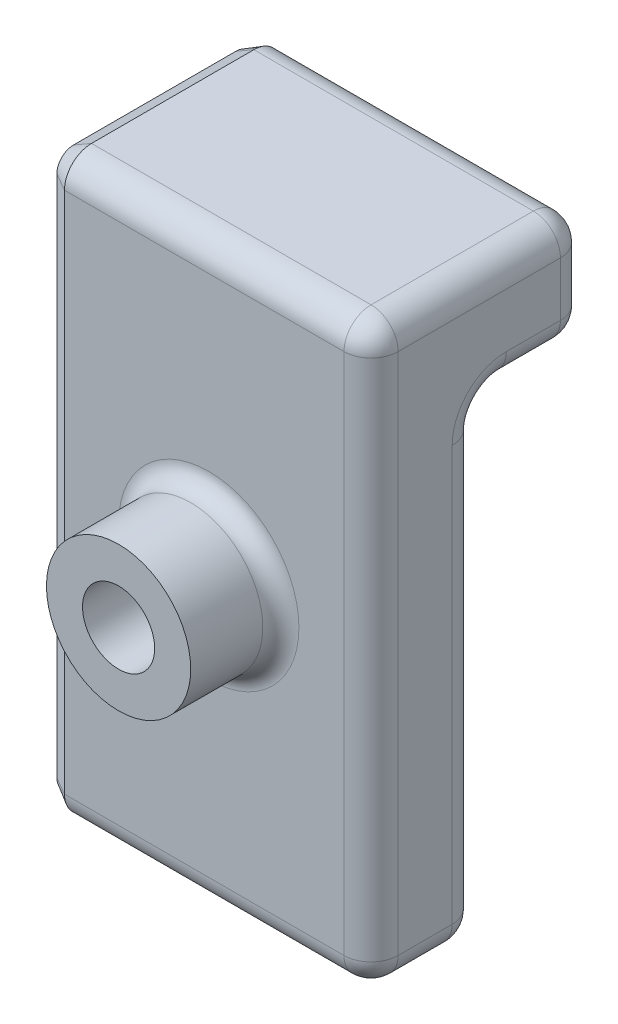
ISO-10303-21;
HEADER;
FILE_DESCRIPTION(('STEP AP214'),'2;1');
FILE_NAME('part.step','',(''),(''),'','','');
FILE_SCHEMA(('AUTOMOTIVE_DESIGN { 1 0 10303 214 1 1 1 1 }'));
ENDSEC;
DATA;
#1=APPLICATION_CONTEXT('core data for automotive mechanical design processes');
#2=APPLICATION_PROTOCOL_DEFINITION('international standard','automotive_design',2000,#1);
#3=PRODUCT_CONTEXT('',#1,'mechanical');
#4=PRODUCT('Part','Part','',(#3));
#5=PRODUCT_RELATED_PRODUCT_CATEGORY('part','',(#4));
#6=PRODUCT_DEFINITION_FORMATION('','',#4);
#7=PRODUCT_DEFINITION_CONTEXT('part definition',#1,'design');
#8=PRODUCT_DEFINITION('design','',#6,#7);
#9=PRODUCT_DEFINITION_SHAPE('','',#8);
#10=(LENGTH_UNIT() NAMED_UNIT(*) SI_UNIT(.MILLI.,.METRE.));
#11=(NAMED_UNIT(*) PLANE_ANGLE_UNIT() SI_UNIT($,.RADIAN.));
#12=(NAMED_UNIT(*) SI_UNIT($,.STERADIAN.) SOLID_ANGLE_UNIT());
#13=UNCERTAINTY_MEASURE_WITH_UNIT(LENGTH_MEASURE(1.E-05),#10,'distance_accuracy_value','');
#14=(GEOMETRIC_REPRESENTATION_CONTEXT(3) GLOBAL_UNCERTAINTY_ASSIGNED_CONTEXT((#13)) GLOBAL_UNIT_ASSIGNED_CONTEXT((#10,
#11,#12)) REPRESENTATION_CONTEXT('',''));
#15=CARTESIAN_POINT('',(0.,0.,0.));
#16=DIRECTION('',(0.,0.,1.));
#17=DIRECTION('',(1.,0.,0.));
#18=AXIS2_PLACEMENT_3D('',#15,#16,#17);
#19=CARTESIAN_POINT('',(18.,0.,0.));
#20=DIRECTION('',(0.,0.,-1.));
#21=DIRECTION('',(-1.,0.,0.));
#22=AXIS2_PLACEMENT_3D('',#19,#20,#21);
#23=PLANE('',#22);
#24=CARTESIAN_POINT('',(9.,16.,0.));
#25=DIRECTION('',(0.,0.,-1.));
#26=DIRECTION('',(-1.,0.,0.));
#27=AXIS2_PLACEMENT_3D('',#24,#25,#26);
#28=CIRCLE('',#27,5.);
#29=CARTESIAN_POINT('',(4.,16.,0.));
#30=VERTEX_POINT('',#29);
#31=EDGE_CURVE('E11',#30,#30,#28,.T.);
#32=ORIENTED_EDGE('',*,*,#31,.T.);
#33=EDGE_LOOP('',(#32));
#34=FACE_BOUND('',#33,.T.);
#35=DIRECTION('',(-1.,0.,0.));
#36=VECTOR('',#35,1.);
#37=CARTESIAN_POINT('',(18.,30.5,0.));
#38=LINE('',#37,#36);
#39=CARTESIAN_POINT('',(16.5,30.5,0.));
#40=VERTEX_POINT('',#39);
#41=CARTESIAN_POINT('',(1.00000000000001,30.5,0.));
#42=VERTEX_POINT('',#41);
#43=EDGE_CURVE('E699',#40,#42,#38,.T.);
#44=ORIENTED_EDGE('',*,*,#43,.T.);
#45=DIRECTION('',(0.,-1.,0.));
#46=VECTOR('',#45,1.);
#47=CARTESIAN_POINT('',(1.00000000000001,1.5,0.));
#48=LINE('',#47,#46);
#49=CARTESIAN_POINT('',(1.00000000000001,1.5,0.));
#50=VERTEX_POINT('',#49);
#51=EDGE_CURVE('E59',#42,#50,#48,.T.);
#52=ORIENTED_EDGE('',*,*,#51,.T.);
#53=DIRECTION('',(-1.,0.,0.));
#54=VECTOR('',#53,1.);
#55=CARTESIAN_POINT('',(18.,1.5,0.));
#56=LINE('',#55,#54);
#57=CARTESIAN_POINT('',(16.5,1.5,0.));
#58=VERTEX_POINT('',#57);
#59=EDGE_CURVE('E680',#50,#58,#56,.F.);
#60=ORIENTED_EDGE('',*,*,#59,.T.);
#61=DIRECTION('',(0.,-1.,0.));
#62=VECTOR('',#61,1.);
#63=CARTESIAN_POINT('',(16.5,0.,0.));
#64=LINE('',#63,#62);
#65=EDGE_CURVE('E696',#58,#40,#64,.F.);
#66=ORIENTED_EDGE('',*,*,#65,.T.);
#67=EDGE_LOOP('',(#44,#52,#60,#66));
#68=FACE_BOUND('',#67,.T.);
#69=ADVANCED_FACE('F43',(#34,#68),#23,.F.);
#70=CARTESIAN_POINT('',(18.,0.,-6.));
#71=DIRECTION('',(0.,1.,0.));
#72=DIRECTION('',(0.,0.,1.));
#73=AXIS2_PLACEMENT_3D('',#70,#71,#72);
#74=PLANE('',#73);
#75=DIRECTION('',(-1.,0.,0.));
#76=VECTOR('',#75,1.);
#77=CARTESIAN_POINT('',(18.,0.,-1.5));
#78=LINE('',#77,#76);
#79=CARTESIAN_POINT('',(16.5,0.,-1.5));
#80=VERTEX_POINT('',#79);
#81=CARTESIAN_POINT('',(1.00000000000001,0.,-1.5));
#82=VERTEX_POINT('',#81);
#83=EDGE_CURVE('E615',#80,#82,#78,.T.);
#84=ORIENTED_EDGE('',*,*,#83,.T.);
#85=DIRECTION('',(0.,0.,-1.));
#86=VECTOR('',#85,1.);
#87=CARTESIAN_POINT('',(1.00000000000001,0.,-4.5));
#88=LINE('',#87,#86);
#89=CARTESIAN_POINT('',(1.00000000000001,0.,-4.5));
#90=VERTEX_POINT('',#89);
#91=EDGE_CURVE('E276',#82,#90,#88,.T.);
#92=ORIENTED_EDGE('',*,*,#91,.T.);
#93=DIRECTION('',(-1.,0.,0.));
#94=VECTOR('',#93,1.);
#95=CARTESIAN_POINT('',(18.,0.,-4.5));
#96=LINE('',#95,#94);
#97=CARTESIAN_POINT('',(16.5,0.,-4.5));
#98=VERTEX_POINT('',#97);
#99=EDGE_CURVE('E628',#90,#98,#96,.F.);
#100=ORIENTED_EDGE('',*,*,#99,.T.);
#101=DIRECTION('',(0.,0.,-1.));
#102=VECTOR('',#101,1.);
#103=CARTESIAN_POINT('',(16.5,0.,-6.));
#104=LINE('',#103,#102);
#105=EDGE_CURVE('E620',#98,#80,#104,.F.);
#106=ORIENTED_EDGE('',*,*,#105,.T.);
#107=EDGE_LOOP('',(#84,#92,#100,#106));
#108=FACE_BOUND('',#107,.T.);
#109=ADVANCED_FACE('F412',(#108),#74,.F.);
#110=CARTESIAN_POINT('',(18.,26.,-6.));
#111=DIRECTION('',(0.,0.,1.));
#112=DIRECTION('',(0.,-1.,0.));
#113=AXIS2_PLACEMENT_3D('',#110,#111,#112);
#114=PLANE('',#113);
#115=CARTESIAN_POINT('',(9.,16.,-6.));
#116=DIRECTION('',(0.,0.,1.));
#117=DIRECTION('',(0.,-1.,0.));
#118=AXIS2_PLACEMENT_3D('',#115,#116,#117);
#119=CIRCLE('',#118,2.);
#120=CARTESIAN_POINT('',(9.,14.,-6.));
#121=VERTEX_POINT('',#120);
#122=EDGE_CURVE('E218',#121,#121,#119,.T.);
#123=ORIENTED_EDGE('',*,*,#122,.T.);
#124=EDGE_LOOP('',(#123));
#125=FACE_BOUND('',#124,.T.);
#126=DIRECTION('',(-1.,0.,0.));
#127=VECTOR('',#126,1.);
#128=CARTESIAN_POINT('',(18.,1.5,-6.));
#129=LINE('',#128,#127);
#130=CARTESIAN_POINT('',(16.5,1.5,-6.));
#131=VERTEX_POINT('',#130);
#132=CARTESIAN_POINT('',(1.00000000000001,1.5,-6.));
#133=VERTEX_POINT('',#132);
#134=EDGE_CURVE('E674',#131,#133,#129,.T.);
#135=ORIENTED_EDGE('',*,*,#134,.T.);
#136=DIRECTION('',(0.,1.,0.));
#137=VECTOR('',#136,1.);
#138=CARTESIAN_POINT('',(1.00000000000001,24.5,-6.));
#139=LINE('',#138,#137);
#140=CARTESIAN_POINT('',(1.00000000000001,24.5,-6.));
#141=VERTEX_POINT('',#140);
#142=EDGE_CURVE('E333',#133,#141,#139,.T.);
#143=ORIENTED_EDGE('',*,*,#142,.T.);
#144=DIRECTION('',(-1.,0.,0.));
#145=VECTOR('',#144,1.);
#146=CARTESIAN_POINT('',(18.,24.5,-6.));
#147=LINE('',#146,#145);
#148=CARTESIAN_POINT('',(16.5,24.5,-6.));
#149=VERTEX_POINT('',#148);
#150=EDGE_CURVE('E685',#141,#149,#147,.F.);
#151=ORIENTED_EDGE('',*,*,#150,.T.);
#152=DIRECTION('',(0.,1.,0.));
#153=VECTOR('',#152,1.);
#154=CARTESIAN_POINT('',(16.5,26.,-6.));
#155=LINE('',#154,#153);
#156=EDGE_CURVE('E681',#149,#131,#155,.F.);
#157=ORIENTED_EDGE('',*,*,#156,.T.);
#158=EDGE_LOOP('',(#135,#143,#151,#157));
#159=FACE_BOUND('',#158,.T.);
#160=ADVANCED_FACE('F420',(#125,#159),#114,.F.);
#161=CARTESIAN_POINT('',(18.,26.,-12.));
#162=DIRECTION('',(0.,1.,0.));
#163=DIRECTION('',(0.,0.,1.));
#164=AXIS2_PLACEMENT_3D('',#161,#162,#163);
#165=PLANE('',#164);
#166=DIRECTION('',(-1.,0.,0.));
#167=VECTOR('',#166,1.);
#168=CARTESIAN_POINT('',(0.,26.,-7.5));
#169=LINE('',#168,#167);
#170=CARTESIAN_POINT('',(16.5,26.,-7.5));
#171=VERTEX_POINT('',#170);
#172=CARTESIAN_POINT('',(1.00000000000001,26.,-7.5));
#173=VERTEX_POINT('',#172);
#174=EDGE_CURVE('E641',#171,#173,#169,.T.);
#175=ORIENTED_EDGE('',*,*,#174,.T.);
#176=DIRECTION('',(0.,0.,-1.));
#177=VECTOR('',#176,1.);
#178=CARTESIAN_POINT('',(1.00000000000001,26.,-10.5));
#179=LINE('',#178,#177);
#180=CARTESIAN_POINT('',(1.00000000000001,26.,-10.5));
#181=VERTEX_POINT('',#180);
#182=EDGE_CURVE('E321',#173,#181,#179,.T.);
#183=ORIENTED_EDGE('',*,*,#182,.T.);
#184=DIRECTION('',(-1.,0.,0.));
#185=VECTOR('',#184,1.);
#186=CARTESIAN_POINT('',(18.,26.,-10.5));
#187=LINE('',#186,#185);
#188=CARTESIAN_POINT('',(16.5,26.,-10.5));
#189=VERTEX_POINT('',#188);
#190=EDGE_CURVE('E281',#181,#189,#187,.F.);
#191=ORIENTED_EDGE('',*,*,#190,.T.);
#192=DIRECTION('',(0.,0.,-1.));
#193=VECTOR('',#192,1.);
#194=CARTESIAN_POINT('',(16.5,26.,-12.));
#195=LINE('',#194,#193);
#196=EDGE_CURVE('E231',#189,#171,#195,.F.);
#197=ORIENTED_EDGE('',*,*,#196,.T.);
#198=EDGE_LOOP('',(#175,#183,#191,#197));
#199=FACE_BOUND('',#198,.T.);
#200=ADVANCED_FACE('F434',(#199),#165,.F.);
#201=CARTESIAN_POINT('',(18.,32.,-12.));
#202=DIRECTION('',(0.,0.,1.));
#203=DIRECTION('',(1.,0.,0.));
#204=AXIS2_PLACEMENT_3D('',#201,#202,#203);
#205=PLANE('',#204);
#206=DIRECTION('',(-1.,0.,0.));
#207=VECTOR('',#206,1.);
#208=CARTESIAN_POINT('',(18.,27.5,-12.));
#209=LINE('',#208,#207);
#210=CARTESIAN_POINT('',(16.5,27.5,-12.));
#211=VERTEX_POINT('',#210);
#212=CARTESIAN_POINT('',(1.00000000000001,27.5,-12.));
#213=VERTEX_POINT('',#212);
#214=EDGE_CURVE('E637',#211,#213,#209,.T.);
#215=ORIENTED_EDGE('',*,*,#214,.T.);
#216=DIRECTION('',(0.,1.,0.));
#217=VECTOR('',#216,1.);
#218=CARTESIAN_POINT('',(1.00000000000001,30.5,-12.));
#219=LINE('',#218,#217);
#220=CARTESIAN_POINT('',(1.00000000000001,30.5,-12.));
#221=VERTEX_POINT('',#220);
#222=EDGE_CURVE('E330',#213,#221,#219,.T.);
#223=ORIENTED_EDGE('',*,*,#222,.T.);
#224=DIRECTION('',(-1.,0.,0.));
#225=VECTOR('',#224,1.);
#226=CARTESIAN_POINT('',(18.,30.5,-12.));
#227=LINE('',#226,#225);
#228=CARTESIAN_POINT('',(16.5,30.5,-12.));
#229=VERTEX_POINT('',#228);
#230=EDGE_CURVE('E634',#221,#229,#227,.F.);
#231=ORIENTED_EDGE('',*,*,#230,.T.);
#232=DIRECTION('',(0.,1.,0.));
#233=VECTOR('',#232,1.);
#234=CARTESIAN_POINT('',(16.5,32.,-12.));
#235=LINE('',#234,#233);
#236=EDGE_CURVE('E631',#229,#211,#235,.F.);
#237=ORIENTED_EDGE('',*,*,#236,.T.);
#238=EDGE_LOOP('',(#215,#223,#231,#237));
#239=FACE_BOUND('',#238,.T.);
#240=ADVANCED_FACE('F430',(#239),#205,.F.);
#241=CARTESIAN_POINT('',(18.,32.,0.));
#242=DIRECTION('',(0.,-1.,0.));
#243=DIRECTION('',(0.,0.,-1.));
#244=AXIS2_PLACEMENT_3D('',#241,#242,#243);
#245=PLANE('',#244);
#246=DIRECTION('',(-1.,0.,0.));
#247=VECTOR('',#246,1.);
#248=CARTESIAN_POINT('',(18.,32.,-10.5));
#249=LINE('',#248,#247);
#250=CARTESIAN_POINT('',(16.5,32.,-10.5));
#251=VERTEX_POINT('',#250);
#252=CARTESIAN_POINT('',(1.00000000000001,32.,-10.5));
#253=VERTEX_POINT('',#252);
#254=EDGE_CURVE('E612',#251,#253,#249,.T.);
#255=ORIENTED_EDGE('',*,*,#254,.T.);
#256=DIRECTION('',(0.,0.,1.));
#257=VECTOR('',#256,1.);
#258=CARTESIAN_POINT('',(1.00000000000001,32.,-1.5));
#259=LINE('',#258,#257);
#260=CARTESIAN_POINT('',(1.00000000000001,32.,-1.5));
#261=VERTEX_POINT('',#260);
#262=EDGE_CURVE('E318',#253,#261,#259,.T.);
#263=ORIENTED_EDGE('',*,*,#262,.T.);
#264=DIRECTION('',(-1.,0.,0.));
#265=VECTOR('',#264,1.);
#266=CARTESIAN_POINT('',(18.,32.,-1.5));
#267=LINE('',#266,#265);
#268=CARTESIAN_POINT('',(16.5,32.,-1.5));
#269=VERTEX_POINT('',#268);
#270=EDGE_CURVE('E609',#261,#269,#267,.F.);
#271=ORIENTED_EDGE('',*,*,#270,.T.);
#272=DIRECTION('',(0.,0.,1.));
#273=VECTOR('',#272,1.);
#274=CARTESIAN_POINT('',(16.5,32.,0.));
#275=LINE('',#274,#273);
#276=EDGE_CURVE('E622',#269,#251,#275,.F.);
#277=ORIENTED_EDGE('',*,*,#276,.T.);
#278=EDGE_LOOP('',(#255,#263,#271,#277));
#279=FACE_BOUND('',#278,.T.);
#280=ADVANCED_FACE('F427',(#279),#245,.F.);
#281=CARTESIAN_POINT('',(18.,0.,0.));
#282=DIRECTION('',(-1.,0.,0.));
#283=DIRECTION('',(0.,0.,1.));
#284=AXIS2_PLACEMENT_3D('',#281,#282,#283);
#285=PLANE('',#284);
#286=DIRECTION('',(0.,-1.,0.));
#287=VECTOR('',#286,1.);
#288=CARTESIAN_POINT('',(18.,0.,-1.5));
#289=LINE('',#288,#287);
#290=CARTESIAN_POINT('',(18.,30.5,-1.5));
#291=VERTEX_POINT('',#290);
#292=CARTESIAN_POINT('',(18.,1.5,-1.5));
#293=VERTEX_POINT('',#292);
#294=EDGE_CURVE('E204',#291,#293,#289,.T.);
#295=ORIENTED_EDGE('',*,*,#294,.T.);
#296=DIRECTION('',(0.,0.,-1.));
#297=VECTOR('',#296,1.);
#298=CARTESIAN_POINT('',(18.,1.5,0.));
#299=LINE('',#298,#297);
#300=CARTESIAN_POINT('',(18.,1.5,-4.5));
#301=VERTEX_POINT('',#300);
#302=EDGE_CURVE('E669',#293,#301,#299,.T.);
#303=ORIENTED_EDGE('',*,*,#302,.T.);
#304=DIRECTION('',(0.,1.,0.));
#305=VECTOR('',#304,1.);
#306=CARTESIAN_POINT('',(18.,0.,-4.5));
#307=LINE('',#306,#305);
#308=CARTESIAN_POINT('',(18.,24.5,-4.5));
#309=VERTEX_POINT('',#308);
#310=EDGE_CURVE('E733',#301,#309,#307,.T.);
#311=ORIENTED_EDGE('',*,*,#310,.T.);
#312=CARTESIAN_POINT('',(18.,24.5,-7.5));
#313=DIRECTION('',(-1.,0.,0.));
#314=DIRECTION('',(0.,0.,1.));
#315=AXIS2_PLACEMENT_3D('',#312,#313,#314);
#316=CIRCLE('',#315,3.);
#317=CARTESIAN_POINT('',(18.,27.5,-7.5));
#318=VERTEX_POINT('',#317);
#319=EDGE_CURVE('E198',#318,#309,#316,.F.);
#320=ORIENTED_EDGE('',*,*,#319,.F.);
#321=DIRECTION('',(0.,0.,-1.));
#322=VECTOR('',#321,1.);
#323=CARTESIAN_POINT('',(18.,27.5,0.));
#324=LINE('',#323,#322);
#325=CARTESIAN_POINT('',(18.,27.5,-10.5));
#326=VERTEX_POINT('',#325);
#327=EDGE_CURVE('E191',#318,#326,#324,.T.);
#328=ORIENTED_EDGE('',*,*,#327,.T.);
#329=DIRECTION('',(0.,1.,0.));
#330=VECTOR('',#329,1.);
#331=CARTESIAN_POINT('',(18.,0.,-10.5));
#332=LINE('',#331,#330);
#333=CARTESIAN_POINT('',(18.,30.5,-10.5));
#334=VERTEX_POINT('',#333);
#335=EDGE_CURVE('E194',#326,#334,#332,.T.);
#336=ORIENTED_EDGE('',*,*,#335,.T.);
#337=DIRECTION('',(0.,0.,1.));
#338=VECTOR('',#337,1.);
#339=CARTESIAN_POINT('',(18.,30.5,0.));
#340=LINE('',#339,#338);
#341=EDGE_CURVE('E205',#334,#291,#340,.T.);
#342=ORIENTED_EDGE('',*,*,#341,.T.);
#343=EDGE_LOOP('',(#295,#303,#311,#320,#328,#336,#342));
#344=FACE_BOUND('',#343,.T.);
#345=ADVANCED_FACE('F193',(#344),#285,.F.);
#346=CARTESIAN_POINT('',(0.,0.,0.));
#347=DIRECTION('',(-1.,0.,0.));
#348=DIRECTION('',(0.,0.,1.));
#349=AXIS2_PLACEMENT_3D('',#346,#347,#348);
#350=PLANE('',#349);
#351=CARTESIAN_POINT('',(0.,27.5,-10.5));
#352=DIRECTION('',(-1.,0.,0.));
#353=DIRECTION('',(0.,0.,1.));
#354=AXIS2_PLACEMENT_3D('',#351,#352,#353);
#355=CIRCLE('',#354,0.922649730810372);
#356=CARTESIAN_POINT('',(0.,27.5,-11.4226497308104));
#357=VERTEX_POINT('',#356);
#358=CARTESIAN_POINT('',(0.,26.5773502691896,-10.5));
#359=VERTEX_POINT('',#358);
#360=EDGE_CURVE('E312',#357,#359,#355,.T.);
#361=ORIENTED_EDGE('',*,*,#360,.T.);
#362=DIRECTION('',(0.,0.,1.));
#363=VECTOR('',#362,1.);
#364=CARTESIAN_POINT('',(0.,26.5773502691896,-7.5));
#365=LINE('',#364,#363);
#366=CARTESIAN_POINT('',(0.,26.5773502691896,-7.5));
#367=VERTEX_POINT('',#366);
#368=EDGE_CURVE('E315',#359,#367,#365,.T.);
#369=ORIENTED_EDGE('',*,*,#368,.T.);
#370=CARTESIAN_POINT('',(0.,24.5,-7.5));
#371=DIRECTION('',(-1.,0.,0.));
#372=DIRECTION('',(0.,0.,1.));
#373=AXIS2_PLACEMENT_3D('',#370,#371,#372);
#374=CIRCLE('',#373,2.07735026918963);
#375=CARTESIAN_POINT('',(0.,24.5,-5.42264973081037));
#376=VERTEX_POINT('',#375);
#377=EDGE_CURVE('E309',#367,#376,#374,.F.);
#378=ORIENTED_EDGE('',*,*,#377,.T.);
#379=DIRECTION('',(0.,-1.,0.));
#380=VECTOR('',#379,1.);
#381=CARTESIAN_POINT('',(0.,1.5,-5.42264973081037));
#382=LINE('',#381,#380);
#383=CARTESIAN_POINT('',(0.,1.5,-5.42264973081037));
#384=VERTEX_POINT('',#383);
#385=EDGE_CURVE('E303',#376,#384,#382,.T.);
#386=ORIENTED_EDGE('',*,*,#385,.T.);
#387=CARTESIAN_POINT('',(0.,1.5,-4.5));
#388=DIRECTION('',(-1.,0.,0.));
#389=DIRECTION('',(0.,0.,1.));
#390=AXIS2_PLACEMENT_3D('',#387,#388,#389);
#391=CIRCLE('',#390,0.922649730810373);
#392=CARTESIAN_POINT('',(0.,0.577350269189626,-4.5));
#393=VERTEX_POINT('',#392);
#394=EDGE_CURVE('E297',#384,#393,#391,.T.);
#395=ORIENTED_EDGE('',*,*,#394,.T.);
#396=DIRECTION('',(0.,0.,1.));
#397=VECTOR('',#396,1.);
#398=CARTESIAN_POINT('',(0.,0.577350269189626,-1.5));
#399=LINE('',#398,#397);
#400=CARTESIAN_POINT('',(0.,0.577350269189626,-1.5));
#401=VERTEX_POINT('',#400);
#402=EDGE_CURVE('E293',#393,#401,#399,.T.);
#403=ORIENTED_EDGE('',*,*,#402,.T.);
#404=CARTESIAN_POINT('',(0.,1.5,-1.5));
#405=DIRECTION('',(-1.,0.,0.));
#406=DIRECTION('',(0.,0.,1.));
#407=AXIS2_PLACEMENT_3D('',#404,#405,#406);
#408=CIRCLE('',#407,0.922649730810374);
#409=CARTESIAN_POINT('',(0.,1.5,-0.577350269189626));
#410=VERTEX_POINT('',#409);
#411=EDGE_CURVE('E284',#401,#410,#408,.T.);
#412=ORIENTED_EDGE('',*,*,#411,.T.);
#413=DIRECTION('',(0.,1.,0.));
#414=VECTOR('',#413,1.);
#415=CARTESIAN_POINT('',(0.,30.5,-0.577350269189626));
#416=LINE('',#415,#414);
#417=CARTESIAN_POINT('',(0.,30.5,-0.577350269189626));
#418=VERTEX_POINT('',#417);
#419=EDGE_CURVE('E280',#410,#418,#416,.T.);
#420=ORIENTED_EDGE('',*,*,#419,.T.);
#421=CARTESIAN_POINT('',(0.,30.5,-1.5));
#422=DIRECTION('',(-1.,0.,0.));
#423=DIRECTION('',(0.,0.,1.));
#424=AXIS2_PLACEMENT_3D('',#421,#422,#423);
#425=CIRCLE('',#424,0.922649730810375);
#426=CARTESIAN_POINT('',(0.,31.4226497308104,-1.5));
#427=VERTEX_POINT('',#426);
#428=EDGE_CURVE('E287',#418,#427,#425,.T.);
#429=ORIENTED_EDGE('',*,*,#428,.T.);
#430=DIRECTION('',(0.,0.,-1.));
#431=VECTOR('',#430,1.);
#432=CARTESIAN_POINT('',(0.,31.4226497308104,-10.5));
#433=LINE('',#432,#431);
#434=CARTESIAN_POINT('',(0.,31.4226497308104,-10.5));
#435=VERTEX_POINT('',#434);
#436=EDGE_CURVE('E290',#427,#435,#433,.T.);
#437=ORIENTED_EDGE('',*,*,#436,.T.);
#438=CARTESIAN_POINT('',(0.,30.5,-10.5));
#439=DIRECTION('',(-1.,0.,0.));
#440=DIRECTION('',(0.,0.,1.));
#441=AXIS2_PLACEMENT_3D('',#438,#439,#440);
#442=CIRCLE('',#441,0.922649730810375);
#443=CARTESIAN_POINT('',(0.,30.5,-11.4226497308104));
#444=VERTEX_POINT('',#443);
#445=EDGE_CURVE('E300',#435,#444,#442,.T.);
#446=ORIENTED_EDGE('',*,*,#445,.T.);
#447=DIRECTION('',(0.,-1.,0.));
#448=VECTOR('',#447,1.);
#449=CARTESIAN_POINT('',(0.,27.5,-11.4226497308104));
#450=LINE('',#449,#448);
#451=EDGE_CURVE('E306',#444,#357,#450,.T.);
#452=ORIENTED_EDGE('',*,*,#451,.T.);
#453=EDGE_LOOP('',(#361,#369,#378,#386,#395,#403,#412,#420,#429,#437,#446,#452));
#454=FACE_BOUND('',#453,.T.);
#455=ADVANCED_FACE('F425',(#454),#350,.T.);
#456=CARTESIAN_POINT('',(9.,16.,-18.));
#457=DIRECTION('',(0.,0.,1.));
#458=DIRECTION('',(1.,0.,0.));
#459=AXIS2_PLACEMENT_3D('',#456,#457,#458);
#460=CYLINDRICAL_SURFACE('',#459,2.);
#461=ORIENTED_EDGE('',*,*,#122,.F.);
#462=EDGE_LOOP('',(#461));
#463=FACE_BOUND('',#462,.T.);
#464=CARTESIAN_POINT('',(9.,16.,5.));
#465=DIRECTION('',(0.,0.,1.));
#466=DIRECTION('',(1.,0.,0.));
#467=AXIS2_PLACEMENT_3D('',#464,#465,#466);
#468=CIRCLE('',#467,2.);
#469=CARTESIAN_POINT('',(11.,16.,5.));
#470=VERTEX_POINT('',#469);
#471=EDGE_CURVE('E748',#470,#470,#468,.T.);
#472=ORIENTED_EDGE('',*,*,#471,.T.);
#473=EDGE_LOOP('',(#472));
#474=FACE_BOUND('',#473,.T.);
#475=ADVANCED_FACE('F508',(#463,#474),#460,.F.);
#476=CARTESIAN_POINT('',(18.,30.5,-1.5));
#477=DIRECTION('',(-1.,0.,0.));
#478=DIRECTION('',(0.,0.,1.));
#479=AXIS2_PLACEMENT_3D('',#476,#477,#478);
#480=CYLINDRICAL_SURFACE('',#479,1.5);
#481=ORIENTED_EDGE('',*,*,#270,.F.);
#482=CARTESIAN_POINT('',(1.00000000000001,30.5,-1.5));
#483=DIRECTION('',(-1.,0.,0.));
#484=DIRECTION('',(0.,0.,1.));
#485=AXIS2_PLACEMENT_3D('',#482,#483,#484);
#486=CIRCLE('',#485,1.5);
#487=EDGE_CURVE('E67',#261,#42,#486,.F.);
#488=ORIENTED_EDGE('',*,*,#487,.T.);
#489=ORIENTED_EDGE('',*,*,#43,.F.);
#490=CARTESIAN_POINT('',(16.5,30.5,-1.5));
#491=DIRECTION('',(1.,0.,0.));
#492=DIRECTION('',(0.,0.,-1.));
#493=AXIS2_PLACEMENT_3D('',#490,#491,#492);
#494=CIRCLE('',#493,1.5);
#495=EDGE_CURVE('E272',#269,#40,#494,.T.);
#496=ORIENTED_EDGE('',*,*,#495,.F.);
#497=EDGE_LOOP('',(#481,#488,#489,#496));
#498=FACE_BOUND('',#497,.T.);
#499=ADVANCED_FACE('F504',(#498),#480,.T.);
#500=CARTESIAN_POINT('',(16.5,30.5,0.));
#501=DIRECTION('',(0.,0.,1.));
#502=DIRECTION('',(1.,0.,0.));
#503=AXIS2_PLACEMENT_3D('',#500,#501,#502);
#504=CYLINDRICAL_SURFACE('',#503,1.5);
#505=CARTESIAN_POINT('',(16.5,30.5,-10.5));
#506=DIRECTION('',(0.,0.,-1.));
#507=DIRECTION('',(-1.,0.,0.));
#508=AXIS2_PLACEMENT_3D('',#505,#506,#507);
#509=CIRCLE('',#508,1.5);
#510=EDGE_CURVE('E264',#251,#334,#509,.T.);
#511=ORIENTED_EDGE('',*,*,#510,.F.);
#512=ORIENTED_EDGE('',*,*,#276,.F.);
#513=CARTESIAN_POINT('',(16.5,30.5,-1.5));
#514=DIRECTION('',(0.,0.,1.));
#515=DIRECTION('',(1.,0.,0.));
#516=AXIS2_PLACEMENT_3D('',#513,#514,#515);
#517=CIRCLE('',#516,1.5);
#518=EDGE_CURVE('E268',#291,#269,#517,.T.);
#519=ORIENTED_EDGE('',*,*,#518,.F.);
#520=ORIENTED_EDGE('',*,*,#341,.F.);
#521=EDGE_LOOP('',(#511,#512,#519,#520));
#522=FACE_BOUND('',#521,.T.);
#523=ADVANCED_FACE('F500',(#522),#504,.T.);
#524=CARTESIAN_POINT('',(18.,30.5,-10.5));
#525=DIRECTION('',(-1.,0.,0.));
#526=DIRECTION('',(0.,0.,1.));
#527=AXIS2_PLACEMENT_3D('',#524,#525,#526);
#528=CYLINDRICAL_SURFACE('',#527,1.5);
#529=ORIENTED_EDGE('',*,*,#230,.F.);
#530=CARTESIAN_POINT('',(1.00000000000001,30.5,-10.5));
#531=DIRECTION('',(-1.,0.,0.));
#532=DIRECTION('',(0.,0.,1.));
#533=AXIS2_PLACEMENT_3D('',#530,#531,#532);
#534=CIRCLE('',#533,1.5);
#535=EDGE_CURVE('E336',#221,#253,#534,.F.);
#536=ORIENTED_EDGE('',*,*,#535,.T.);
#537=ORIENTED_EDGE('',*,*,#254,.F.);
#538=CARTESIAN_POINT('',(16.5,30.5,-10.5));
#539=DIRECTION('',(1.,0.,0.));
#540=DIRECTION('',(0.,0.,-1.));
#541=AXIS2_PLACEMENT_3D('',#538,#539,#540);
#542=CIRCLE('',#541,1.5);
#543=EDGE_CURVE('E260',#229,#251,#542,.T.);
#544=ORIENTED_EDGE('',*,*,#543,.F.);
#545=EDGE_LOOP('',(#529,#536,#537,#544));
#546=FACE_BOUND('',#545,.T.);
#547=ADVANCED_FACE('F496',(#546),#528,.T.);
#548=CARTESIAN_POINT('',(16.5,30.5,-1.5));
#549=DIRECTION('',(0.,1.,0.));
#550=DIRECTION('',(0.,0.,1.));
#551=AXIS2_PLACEMENT_3D('',#548,#549,#550);
#552=SPHERICAL_SURFACE('',#551,1.5);
#553=ORIENTED_EDGE('',*,*,#518,.T.);
#554=ORIENTED_EDGE('',*,*,#495,.T.);
#555=CARTESIAN_POINT('',(16.5,30.5,-1.5));
#556=DIRECTION('',(0.,1.,0.));
#557=DIRECTION('',(0.,0.,1.));
#558=AXIS2_PLACEMENT_3D('',#555,#556,#557);
#559=CIRCLE('',#558,1.5);
#560=EDGE_CURVE('E256',#291,#40,#559,.F.);
#561=ORIENTED_EDGE('',*,*,#560,.F.);
#562=EDGE_LOOP('',(#553,#554,#561));
#563=FACE_BOUND('',#562,.T.);
#564=ADVANCED_FACE('F492',(#563),#552,.T.);
#565=CARTESIAN_POINT('',(16.5,30.5,-10.5));
#566=DIRECTION('',(0.,1.,0.));
#567=DIRECTION('',(0.,0.,1.));
#568=AXIS2_PLACEMENT_3D('',#565,#566,#567);
#569=SPHERICAL_SURFACE('',#568,1.5);
#570=ORIENTED_EDGE('',*,*,#543,.T.);
#571=ORIENTED_EDGE('',*,*,#510,.T.);
#572=CARTESIAN_POINT('',(16.5,30.5,-10.5));
#573=DIRECTION('',(0.,1.,0.));
#574=DIRECTION('',(0.,0.,1.));
#575=AXIS2_PLACEMENT_3D('',#572,#573,#574);
#576=CIRCLE('',#575,1.5);
#577=EDGE_CURVE('E216',#229,#334,#576,.F.);
#578=ORIENTED_EDGE('',*,*,#577,.F.);
#579=EDGE_LOOP('',(#570,#571,#578));
#580=FACE_BOUND('',#579,.T.);
#581=ADVANCED_FACE('F488',(#580),#569,.T.);
#582=CARTESIAN_POINT('',(18.,1.5,-1.5));
#583=DIRECTION('',(-1.,0.,0.));
#584=DIRECTION('',(0.,0.,1.));
#585=AXIS2_PLACEMENT_3D('',#582,#583,#584);
#586=CYLINDRICAL_SURFACE('',#585,1.5);
#587=ORIENTED_EDGE('',*,*,#59,.F.);
#588=CARTESIAN_POINT('',(1.00000000000001,1.5,-1.5));
#589=DIRECTION('',(-1.,0.,0.));
#590=DIRECTION('',(0.,0.,1.));
#591=AXIS2_PLACEMENT_3D('',#588,#589,#590);
#592=CIRCLE('',#591,1.5);
#593=EDGE_CURVE('E344',#50,#82,#592,.F.);
#594=ORIENTED_EDGE('',*,*,#593,.T.);
#595=ORIENTED_EDGE('',*,*,#83,.F.);
#596=CARTESIAN_POINT('',(16.5,1.5,-1.5));
#597=DIRECTION('',(1.,0.,0.));
#598=DIRECTION('',(0.,0.,-1.));
#599=AXIS2_PLACEMENT_3D('',#596,#597,#598);
#600=CIRCLE('',#599,1.5);
#601=EDGE_CURVE('E250',#58,#80,#600,.T.);
#602=ORIENTED_EDGE('',*,*,#601,.F.);
#603=EDGE_LOOP('',(#587,#594,#595,#602));
#604=FACE_BOUND('',#603,.T.);
#605=ADVANCED_FACE('F484',(#604),#586,.T.);
#606=CARTESIAN_POINT('',(16.5,0.,-1.5));
#607=DIRECTION('',(0.,-1.,0.));
#608=DIRECTION('',(0.,0.,-1.));
#609=AXIS2_PLACEMENT_3D('',#606,#607,#608);
#610=CYLINDRICAL_SURFACE('',#609,1.5);
#611=ORIENTED_EDGE('',*,*,#560,.T.);
#612=ORIENTED_EDGE('',*,*,#65,.F.);
#613=CARTESIAN_POINT('',(16.5,1.5,-1.5));
#614=DIRECTION('',(0.,-1.,0.));
#615=DIRECTION('',(0.,0.,-1.));
#616=AXIS2_PLACEMENT_3D('',#613,#614,#615);
#617=CIRCLE('',#616,1.5);
#618=EDGE_CURVE('E228',#293,#58,#617,.T.);
#619=ORIENTED_EDGE('',*,*,#618,.F.);
#620=ORIENTED_EDGE('',*,*,#294,.F.);
#621=EDGE_LOOP('',(#611,#612,#619,#620));
#622=FACE_BOUND('',#621,.T.);
#623=ADVANCED_FACE('F481',(#622),#610,.T.);
#624=CARTESIAN_POINT('',(16.5,0.,-10.5));
#625=DIRECTION('',(0.,1.,0.));
#626=DIRECTION('',(0.,0.,1.));
#627=AXIS2_PLACEMENT_3D('',#624,#625,#626);
#628=CYLINDRICAL_SURFACE('',#627,1.5);
#629=ORIENTED_EDGE('',*,*,#577,.T.);
#630=ORIENTED_EDGE('',*,*,#335,.F.);
#631=CARTESIAN_POINT('',(16.5,27.5,-10.5));
#632=DIRECTION('',(0.,-1.,0.));
#633=DIRECTION('',(0.,0.,-1.));
#634=AXIS2_PLACEMENT_3D('',#631,#632,#633);
#635=CIRCLE('',#634,1.5);
#636=EDGE_CURVE('E213',#211,#326,#635,.T.);
#637=ORIENTED_EDGE('',*,*,#636,.F.);
#638=ORIENTED_EDGE('',*,*,#236,.F.);
#639=EDGE_LOOP('',(#629,#630,#637,#638));
#640=FACE_BOUND('',#639,.T.);
#641=ADVANCED_FACE('F211',(#640),#628,.T.);
#642=CARTESIAN_POINT('',(18.,27.5,-10.5));
#643=DIRECTION('',(-1.,0.,0.));
#644=DIRECTION('',(0.,0.,1.));
#645=AXIS2_PLACEMENT_3D('',#642,#643,#644);
#646=CYLINDRICAL_SURFACE('',#645,1.5);
#647=ORIENTED_EDGE('',*,*,#190,.F.);
#648=CARTESIAN_POINT('',(1.00000000000001,27.5,-10.5));
#649=DIRECTION('',(-1.,0.,0.));
#650=DIRECTION('',(0.,0.,1.));
#651=AXIS2_PLACEMENT_3D('',#648,#649,#650);
#652=CIRCLE('',#651,1.5);
#653=EDGE_CURVE('E324',#181,#213,#652,.F.);
#654=ORIENTED_EDGE('',*,*,#653,.T.);
#655=ORIENTED_EDGE('',*,*,#214,.F.);
#656=CARTESIAN_POINT('',(16.5,27.5,-10.5));
#657=DIRECTION('',(1.,0.,0.));
#658=DIRECTION('',(0.,0.,-1.));
#659=AXIS2_PLACEMENT_3D('',#656,#657,#658);
#660=CIRCLE('',#659,1.5);
#661=EDGE_CURVE('E226',#189,#211,#660,.T.);
#662=ORIENTED_EDGE('',*,*,#661,.F.);
#663=EDGE_LOOP('',(#647,#654,#655,#662));
#664=FACE_BOUND('',#663,.T.);
#665=ADVANCED_FACE('F474',(#664),#646,.T.);
#666=CARTESIAN_POINT('',(16.5,1.5,-1.5));
#667=DIRECTION('',(0.,0.,1.));
#668=DIRECTION('',(1.,0.,0.));
#669=AXIS2_PLACEMENT_3D('',#666,#667,#668);
#670=SPHERICAL_SURFACE('',#669,1.5);
#671=ORIENTED_EDGE('',*,*,#618,.T.);
#672=ORIENTED_EDGE('',*,*,#601,.T.);
#673=CARTESIAN_POINT('',(16.5,1.5,-1.5));
#674=DIRECTION('',(0.,0.,1.));
#675=DIRECTION('',(1.,0.,0.));
#676=AXIS2_PLACEMENT_3D('',#673,#674,#675);
#677=CIRCLE('',#676,1.5);
#678=EDGE_CURVE('E233',#293,#80,#677,.F.);
#679=ORIENTED_EDGE('',*,*,#678,.F.);
#680=EDGE_LOOP('',(#671,#672,#679));
#681=FACE_BOUND('',#680,.T.);
#682=ADVANCED_FACE('F471',(#681),#670,.T.);
#683=CARTESIAN_POINT('',(16.5,27.5,-10.5));
#684=DIRECTION('',(0.,0.,-1.));
#685=DIRECTION('',(-1.,0.,0.));
#686=AXIS2_PLACEMENT_3D('',#683,#684,#685);
#687=SPHERICAL_SURFACE('',#686,1.5);
#688=ORIENTED_EDGE('',*,*,#661,.T.);
#689=ORIENTED_EDGE('',*,*,#636,.T.);
#690=CARTESIAN_POINT('',(16.5,27.5,-10.5));
#691=DIRECTION('',(0.,0.,-1.));
#692=DIRECTION('',(-1.,0.,0.));
#693=AXIS2_PLACEMENT_3D('',#690,#691,#692);
#694=CIRCLE('',#693,1.5);
#695=EDGE_CURVE('E223',#189,#326,#694,.F.);
#696=ORIENTED_EDGE('',*,*,#695,.F.);
#697=EDGE_LOOP('',(#688,#689,#696));
#698=FACE_BOUND('',#697,.T.);
#699=ADVANCED_FACE('F222',(#698),#687,.T.);
#700=CARTESIAN_POINT('',(18.,1.5,-4.5));
#701=DIRECTION('',(-1.,0.,0.));
#702=DIRECTION('',(0.,0.,1.));
#703=AXIS2_PLACEMENT_3D('',#700,#701,#702);
#704=CYLINDRICAL_SURFACE('',#703,1.5);
#705=ORIENTED_EDGE('',*,*,#99,.F.);
#706=CARTESIAN_POINT('',(1.00000000000001,1.5,-4.5));
#707=DIRECTION('',(-1.,0.,0.));
#708=DIRECTION('',(0.,0.,1.));
#709=AXIS2_PLACEMENT_3D('',#706,#707,#708);
#710=CIRCLE('',#709,1.5);
#711=EDGE_CURVE('E339',#90,#133,#710,.F.);
#712=ORIENTED_EDGE('',*,*,#711,.T.);
#713=ORIENTED_EDGE('',*,*,#134,.F.);
#714=CARTESIAN_POINT('',(16.5,1.5,-4.5));
#715=DIRECTION('',(1.,0.,0.));
#716=DIRECTION('',(0.,0.,-1.));
#717=AXIS2_PLACEMENT_3D('',#714,#715,#716);
#718=CIRCLE('',#717,1.5);
#719=EDGE_CURVE('E234',#98,#131,#718,.T.);
#720=ORIENTED_EDGE('',*,*,#719,.F.);
#721=EDGE_LOOP('',(#705,#712,#713,#720));
#722=FACE_BOUND('',#721,.T.);
#723=ADVANCED_FACE('F464',(#722),#704,.T.);
#724=CARTESIAN_POINT('',(16.5,1.5,0.));
#725=DIRECTION('',(0.,0.,-1.));
#726=DIRECTION('',(0.,1.,0.));
#727=AXIS2_PLACEMENT_3D('',#724,#725,#726);
#728=CYLINDRICAL_SURFACE('',#727,1.5);
#729=ORIENTED_EDGE('',*,*,#678,.T.);
#730=ORIENTED_EDGE('',*,*,#105,.F.);
#731=CARTESIAN_POINT('',(16.5,1.5,-4.5));
#732=DIRECTION('',(0.,0.,-1.));
#733=DIRECTION('',(-1.,0.,0.));
#734=AXIS2_PLACEMENT_3D('',#731,#732,#733);
#735=CIRCLE('',#734,1.5);
#736=EDGE_CURVE('E241',#301,#98,#735,.T.);
#737=ORIENTED_EDGE('',*,*,#736,.F.);
#738=ORIENTED_EDGE('',*,*,#302,.F.);
#739=EDGE_LOOP('',(#729,#730,#737,#738));
#740=FACE_BOUND('',#739,.T.);
#741=ADVANCED_FACE('F461',(#740),#728,.T.);
#742=CARTESIAN_POINT('',(16.5,27.5,0.));
#743=DIRECTION('',(0.,0.,-1.));
#744=DIRECTION('',(-1.,0.,0.));
#745=AXIS2_PLACEMENT_3D('',#742,#743,#744);
#746=CYLINDRICAL_SURFACE('',#745,1.5);
#747=ORIENTED_EDGE('',*,*,#695,.T.);
#748=ORIENTED_EDGE('',*,*,#327,.F.);
#749=CARTESIAN_POINT('',(16.5,27.5,-7.5));
#750=DIRECTION('',(0.,0.,1.));
#751=DIRECTION('',(1.,0.,0.));
#752=AXIS2_PLACEMENT_3D('',#749,#750,#751);
#753=CIRCLE('',#752,1.5);
#754=EDGE_CURVE('E658',#171,#318,#753,.T.);
#755=ORIENTED_EDGE('',*,*,#754,.F.);
#756=ORIENTED_EDGE('',*,*,#196,.F.);
#757=EDGE_LOOP('',(#747,#748,#755,#756));
#758=FACE_BOUND('',#757,.T.);
#759=ADVANCED_FACE('F230',(#758),#746,.T.);
#760=CARTESIAN_POINT('',(18.,24.5,-7.5));
#761=DIRECTION('',(1.,0.,0.));
#762=DIRECTION('',(0.,0.,-1.));
#763=AXIS2_PLACEMENT_3D('',#760,#761,#762);
#764=CYLINDRICAL_SURFACE('',#763,1.5);
#765=ORIENTED_EDGE('',*,*,#150,.F.);
#766=CARTESIAN_POINT('',(1.00000000000001,24.5,-7.5));
#767=DIRECTION('',(-1.,0.,0.));
#768=DIRECTION('',(0.,0.,1.));
#769=AXIS2_PLACEMENT_3D('',#766,#767,#768);
#770=CIRCLE('',#769,1.5);
#771=EDGE_CURVE('E327',#141,#173,#770,.T.);
#772=ORIENTED_EDGE('',*,*,#771,.T.);
#773=ORIENTED_EDGE('',*,*,#174,.F.);
#774=CARTESIAN_POINT('',(16.5,24.5,-7.5));
#775=DIRECTION('',(-1.,0.,0.));
#776=DIRECTION('',(0.,0.,1.));
#777=AXIS2_PLACEMENT_3D('',#774,#775,#776);
#778=CIRCLE('',#777,1.5);
#779=EDGE_CURVE('E654',#149,#171,#778,.T.);
#780=ORIENTED_EDGE('',*,*,#779,.F.);
#781=EDGE_LOOP('',(#765,#772,#773,#780));
#782=FACE_BOUND('',#781,.T.);
#783=ADVANCED_FACE('F454',(#782),#764,.F.);
#784=CARTESIAN_POINT('',(16.5,1.5,-4.5));
#785=DIRECTION('',(0.,-1.,0.));
#786=DIRECTION('',(0.,0.,-1.));
#787=AXIS2_PLACEMENT_3D('',#784,#785,#786);
#788=SPHERICAL_SURFACE('',#787,1.5);
#789=ORIENTED_EDGE('',*,*,#736,.T.);
#790=ORIENTED_EDGE('',*,*,#719,.T.);
#791=CARTESIAN_POINT('',(16.5,1.5,-4.5));
#792=DIRECTION('',(0.,-1.,0.));
#793=DIRECTION('',(1.,0.,0.));
#794=AXIS2_PLACEMENT_3D('',#791,#792,#793);
#795=CIRCLE('',#794,1.5);
#796=EDGE_CURVE('E651',#301,#131,#795,.F.);
#797=ORIENTED_EDGE('',*,*,#796,.F.);
#798=EDGE_LOOP('',(#789,#790,#797));
#799=FACE_BOUND('',#798,.T.);
#800=ADVANCED_FACE('F450',(#799),#788,.T.);
#801=CARTESIAN_POINT('',(16.5,24.5,-7.5));
#802=DIRECTION('',(-1.,0.,0.));
#803=DIRECTION('',(0.,0.,1.));
#804=AXIS2_PLACEMENT_3D('',#801,#802,#803);
#805=TOROIDAL_SURFACE('',#804,3.,1.5);
#806=ORIENTED_EDGE('',*,*,#754,.T.);
#807=ORIENTED_EDGE('',*,*,#319,.T.);
#808=CARTESIAN_POINT('',(16.5,24.5,-4.5));
#809=DIRECTION('',(0.,1.,0.));
#810=DIRECTION('',(0.,0.,1.));
#811=AXIS2_PLACEMENT_3D('',#808,#809,#810);
#812=CIRCLE('',#811,1.5);
#813=EDGE_CURVE('E395',#149,#309,#812,.F.);
#814=ORIENTED_EDGE('',*,*,#813,.F.);
#815=ORIENTED_EDGE('',*,*,#779,.T.);
#816=EDGE_LOOP('',(#806,#807,#814,#815));
#817=FACE_BOUND('',#816,.T.);
#818=ADVANCED_FACE('F446',(#817),#805,.T.);
#819=CARTESIAN_POINT('',(16.5,0.,-4.5));
#820=DIRECTION('',(0.,1.,0.));
#821=DIRECTION('',(0.,0.,1.));
#822=AXIS2_PLACEMENT_3D('',#819,#820,#821);
#823=CYLINDRICAL_SURFACE('',#822,1.5);
#824=ORIENTED_EDGE('',*,*,#796,.T.);
#825=ORIENTED_EDGE('',*,*,#156,.F.);
#826=ORIENTED_EDGE('',*,*,#813,.T.);
#827=ORIENTED_EDGE('',*,*,#310,.F.);
#828=EDGE_LOOP('',(#824,#825,#826,#827));
#829=FACE_BOUND('',#828,.T.);
#830=ADVANCED_FACE('F442',(#829),#823,.T.);
#831=CARTESIAN_POINT('',(1.00000000000001,32.,-12.));
#832=DIRECTION('',(-0.499999999999997,0.,-0.86602540378444));
#833=DIRECTION('',(0.,-1.,0.));
#834=AXIS2_PLACEMENT_3D('',#831,#832,#833);
#835=PLANE('',#834);
#836=DIRECTION('',(0.86602540378444,0.,-0.499999999999997));
#837=VECTOR('',#836,1.);
#838=CARTESIAN_POINT('',(0.,27.5,-11.4226497308104));
#839=LINE('',#838,#837);
#840=EDGE_CURVE('E388',#357,#213,#839,.T.);
#841=ORIENTED_EDGE('',*,*,#840,.F.);
#842=ORIENTED_EDGE('',*,*,#451,.F.);
#843=DIRECTION('',(-0.86602540378444,0.,0.499999999999997));
#844=VECTOR('',#843,1.);
#845=CARTESIAN_POINT('',(1.00000000000001,30.5,-12.));
#846=LINE('',#845,#844);
#847=EDGE_CURVE('E392',#221,#444,#846,.T.);
#848=ORIENTED_EDGE('',*,*,#847,.F.);
#849=ORIENTED_EDGE('',*,*,#222,.F.);
#850=EDGE_LOOP('',(#841,#842,#848,#849));
#851=FACE_BOUND('',#850,.T.);
#852=ADVANCED_FACE('F445',(#851),#835,.T.);
#853=CARTESIAN_POINT('',(0.,30.5,-10.5));
#854=DIRECTION('',(1.,0.,0.));
#855=DIRECTION('',(0.,0.,-1.));
#856=AXIS2_PLACEMENT_3D('',#853,#854,#855);
#857=CONICAL_SURFACE('',#856,0.922649730810375,0.523598775598295);
#858=ORIENTED_EDGE('',*,*,#847,.T.);
#859=ORIENTED_EDGE('',*,*,#445,.F.);
#860=DIRECTION('',(-0.86602540378444,-0.499999999999997,0.));
#861=VECTOR('',#860,1.);
#862=CARTESIAN_POINT('',(1.00000000000001,32.,-10.5));
#863=LINE('',#862,#861);
#864=EDGE_CURVE('E384',#253,#435,#863,.T.);
#865=ORIENTED_EDGE('',*,*,#864,.F.);
#866=ORIENTED_EDGE('',*,*,#535,.F.);
#867=EDGE_LOOP('',(#858,#859,#865,#866));
#868=FACE_BOUND('',#867,.T.);
#869=ADVANCED_FACE('F579',(#868),#857,.T.);
#870=CARTESIAN_POINT('',(0.,27.5,-10.5));
#871=DIRECTION('',(1.,0.,0.));
#872=DIRECTION('',(0.,0.,-1.));
#873=AXIS2_PLACEMENT_3D('',#870,#871,#872);
#874=CONICAL_SURFACE('',#873,0.922649730810373,0.523598775598296);
#875=ORIENTED_EDGE('',*,*,#840,.T.);
#876=ORIENTED_EDGE('',*,*,#653,.F.);
#877=DIRECTION('',(0.866025403784439,-0.5,0.));
#878=VECTOR('',#877,1.);
#879=CARTESIAN_POINT('',(0.,26.5773502691896,-10.5));
#880=LINE('',#879,#878);
#881=EDGE_CURVE('E380',#359,#181,#880,.T.);
#882=ORIENTED_EDGE('',*,*,#881,.F.);
#883=ORIENTED_EDGE('',*,*,#360,.F.);
#884=EDGE_LOOP('',(#875,#876,#882,#883));
#885=FACE_BOUND('',#884,.T.);
#886=ADVANCED_FACE('F572',(#885),#874,.T.);
#887=CARTESIAN_POINT('',(1.00000000000001,32.,0.));
#888=DIRECTION('',(-0.499999999999993,0.866025403784443,0.));
#889=DIRECTION('',(0.,0.,-1.));
#890=AXIS2_PLACEMENT_3D('',#887,#888,#889);
#891=PLANE('',#890);
#892=ORIENTED_EDGE('',*,*,#864,.T.);
#893=ORIENTED_EDGE('',*,*,#436,.F.);
#894=DIRECTION('',(-0.866025403784443,-0.499999999999993,0.));
#895=VECTOR('',#894,1.);
#896=CARTESIAN_POINT('',(1.00000000000001,32.,-1.5));
#897=LINE('',#896,#895);
#898=EDGE_CURVE('E376',#261,#427,#897,.T.);
#899=ORIENTED_EDGE('',*,*,#898,.F.);
#900=ORIENTED_EDGE('',*,*,#262,.F.);
#901=EDGE_LOOP('',(#892,#893,#899,#900));
#902=FACE_BOUND('',#901,.T.);
#903=ADVANCED_FACE('F565',(#902),#891,.T.);
#904=CARTESIAN_POINT('',(1.00000000000001,26.,-12.));
#905=DIRECTION('',(-0.499999999999997,-0.86602540378444,0.));
#906=DIRECTION('',(0.,0.,1.));
#907=AXIS2_PLACEMENT_3D('',#904,#905,#906);
#908=PLANE('',#907);
#909=ORIENTED_EDGE('',*,*,#881,.T.);
#910=ORIENTED_EDGE('',*,*,#182,.F.);
#911=DIRECTION('',(0.86602540378444,-0.499999999999997,0.));
#912=VECTOR('',#911,1.);
#913=CARTESIAN_POINT('',(0.,26.5773502691896,-7.5));
#914=LINE('',#913,#912);
#915=EDGE_CURVE('E372',#367,#173,#914,.T.);
#916=ORIENTED_EDGE('',*,*,#915,.F.);
#917=ORIENTED_EDGE('',*,*,#368,.F.);
#918=EDGE_LOOP('',(#909,#910,#916,#917));
#919=FACE_BOUND('',#918,.T.);
#920=ADVANCED_FACE('F558',(#919),#908,.T.);
#921=CARTESIAN_POINT('',(0.,30.5,-1.5));
#922=DIRECTION('',(1.,0.,0.));
#923=DIRECTION('',(0.,0.,-1.));
#924=AXIS2_PLACEMENT_3D('',#921,#922,#923);
#925=CONICAL_SURFACE('',#924,0.922649730810374,0.523598775598296);
#926=ORIENTED_EDGE('',*,*,#898,.T.);
#927=ORIENTED_EDGE('',*,*,#428,.F.);
#928=DIRECTION('',(-0.866025403784441,0.,-0.499999999999997));
#929=VECTOR('',#928,1.);
#930=CARTESIAN_POINT('',(1.00000000000001,30.5,0.));
#931=LINE('',#930,#929);
#932=EDGE_CURVE('E368',#42,#418,#931,.T.);
#933=ORIENTED_EDGE('',*,*,#932,.F.);
#934=ORIENTED_EDGE('',*,*,#487,.F.);
#935=EDGE_LOOP('',(#926,#927,#933,#934));
#936=FACE_BOUND('',#935,.T.);
#937=ADVANCED_FACE('F551',(#936),#925,.T.);
#938=CARTESIAN_POINT('',(0.,24.5,-7.5));
#939=DIRECTION('',(-1.,0.,0.));
#940=DIRECTION('',(0.,0.,1.));
#941=AXIS2_PLACEMENT_3D('',#938,#939,#940);
#942=CONICAL_SURFACE('',#941,2.07735026918963,0.523598775598295);
#943=ORIENTED_EDGE('',*,*,#915,.T.);
#944=ORIENTED_EDGE('',*,*,#771,.F.);
#945=DIRECTION('',(0.86602540378444,0.,-0.499999999999997));
#946=VECTOR('',#945,1.);
#947=CARTESIAN_POINT('',(0.,24.5,-5.42264973081037));
#948=LINE('',#947,#946);
#949=EDGE_CURVE('E364',#376,#141,#948,.T.);
#950=ORIENTED_EDGE('',*,*,#949,.F.);
#951=ORIENTED_EDGE('',*,*,#377,.F.);
#952=EDGE_LOOP('',(#943,#944,#950,#951));
#953=FACE_BOUND('',#952,.T.);
#954=ADVANCED_FACE('F544',(#953),#942,.F.);
#955=CARTESIAN_POINT('',(1.00000000000001,0.,0.));
#956=DIRECTION('',(-0.499999999999997,0.,0.86602540378444));
#957=DIRECTION('',(0.,1.,0.));
#958=AXIS2_PLACEMENT_3D('',#955,#956,#957);
#959=PLANE('',#958);
#960=ORIENTED_EDGE('',*,*,#932,.T.);
#961=ORIENTED_EDGE('',*,*,#419,.F.);
#962=DIRECTION('',(-0.86602540378444,0.,-0.499999999999997));
#963=VECTOR('',#962,1.);
#964=CARTESIAN_POINT('',(1.00000000000001,1.5,0.));
#965=LINE('',#964,#963);
#966=EDGE_CURVE('E360',#50,#410,#965,.T.);
#967=ORIENTED_EDGE('',*,*,#966,.F.);
#968=ORIENTED_EDGE('',*,*,#51,.F.);
#969=EDGE_LOOP('',(#960,#961,#967,#968));
#970=FACE_BOUND('',#969,.T.);
#971=ADVANCED_FACE('F537',(#970),#959,.T.);
#972=CARTESIAN_POINT('',(1.00000000000001,26.,-6.));
#973=DIRECTION('',(-0.499999999999997,0.,-0.86602540378444));
#974=DIRECTION('',(0.,-1.,0.));
#975=AXIS2_PLACEMENT_3D('',#972,#973,#974);
#976=PLANE('',#975);
#977=ORIENTED_EDGE('',*,*,#949,.T.);
#978=ORIENTED_EDGE('',*,*,#142,.F.);
#979=DIRECTION('',(0.86602540378444,0.,-0.499999999999997));
#980=VECTOR('',#979,1.);
#981=CARTESIAN_POINT('',(0.,1.5,-5.42264973081037));
#982=LINE('',#981,#980);
#983=EDGE_CURVE('E356',#384,#133,#982,.T.);
#984=ORIENTED_EDGE('',*,*,#983,.F.);
#985=ORIENTED_EDGE('',*,*,#385,.F.);
#986=EDGE_LOOP('',(#977,#978,#984,#985));
#987=FACE_BOUND('',#986,.T.);
#988=ADVANCED_FACE('F530',(#987),#976,.T.);
#989=CARTESIAN_POINT('',(0.,1.5,-1.5));
#990=DIRECTION('',(1.,0.,0.));
#991=DIRECTION('',(0.,0.,-1.));
#992=AXIS2_PLACEMENT_3D('',#989,#990,#991);
#993=CONICAL_SURFACE('',#992,0.922649730810374,0.523598775598296);
#994=ORIENTED_EDGE('',*,*,#966,.T.);
#995=ORIENTED_EDGE('',*,*,#411,.F.);
#996=DIRECTION('',(-0.86602540378444,0.499999999999997,0.));
#997=VECTOR('',#996,1.);
#998=CARTESIAN_POINT('',(1.00000000000001,0.,-1.5));
#999=LINE('',#998,#997);
#1000=EDGE_CURVE('E352',#82,#401,#999,.T.);
#1001=ORIENTED_EDGE('',*,*,#1000,.F.);
#1002=ORIENTED_EDGE('',*,*,#593,.F.);
#1003=EDGE_LOOP('',(#994,#995,#1001,#1002));
#1004=FACE_BOUND('',#1003,.T.);
#1005=ADVANCED_FACE('F523',(#1004),#993,.T.);
#1006=CARTESIAN_POINT('',(0.,1.5,-4.5));
#1007=DIRECTION('',(1.,0.,0.));
#1008=DIRECTION('',(0.,0.,-1.));
#1009=AXIS2_PLACEMENT_3D('',#1006,#1007,#1008);
#1010=CONICAL_SURFACE('',#1009,0.922649730810373,0.523598775598296);
#1011=ORIENTED_EDGE('',*,*,#983,.T.);
#1012=ORIENTED_EDGE('',*,*,#711,.F.);
#1013=DIRECTION('',(0.86602540378444,-0.499999999999998,0.));
#1014=VECTOR('',#1013,1.);
#1015=CARTESIAN_POINT('',(0.,0.577350269189628,-4.5));
#1016=LINE('',#1015,#1014);
#1017=EDGE_CURVE('E349',#393,#90,#1016,.T.);
#1018=ORIENTED_EDGE('',*,*,#1017,.F.);
#1019=ORIENTED_EDGE('',*,*,#394,.F.);
#1020=EDGE_LOOP('',(#1011,#1012,#1018,#1019));
#1021=FACE_BOUND('',#1020,.T.);
#1022=ADVANCED_FACE('F516',(#1021),#1010,.T.);
#1023=CARTESIAN_POINT('',(1.00000000000001,0.,-6.));
#1024=DIRECTION('',(-0.499999999999997,-0.86602540378444,0.));
#1025=DIRECTION('',(0.,0.,1.));
#1026=AXIS2_PLACEMENT_3D('',#1023,#1024,#1025);
#1027=PLANE('',#1026);
#1028=ORIENTED_EDGE('',*,*,#1000,.T.);
#1029=ORIENTED_EDGE('',*,*,#402,.F.);
#1030=ORIENTED_EDGE('',*,*,#1017,.T.);
#1031=ORIENTED_EDGE('',*,*,#91,.F.);
#1032=EDGE_LOOP('',(#1028,#1029,#1030,#1031));
#1033=FACE_BOUND('',#1032,.T.);
#1034=ADVANCED_FACE('F510',(#1033),#1027,.T.);
#1035=CARTESIAN_POINT('',(9.,16.,5.));
#1036=DIRECTION('',(0.,0.,1.));
#1037=DIRECTION('',(1.,0.,0.));
#1038=AXIS2_PLACEMENT_3D('',#1035,#1036,#1037);
#1039=PLANE('',#1038);
#1040=CARTESIAN_POINT('',(9.,16.,5.));
#1041=DIRECTION('',(0.,0.,1.));
#1042=DIRECTION('',(1.,0.,0.));
#1043=AXIS2_PLACEMENT_3D('',#1040,#1041,#1042);
#1044=CIRCLE('',#1043,4.);
#1045=CARTESIAN_POINT('',(13.,16.,5.));
#1046=VERTEX_POINT('',#1045);
#1047=EDGE_CURVE('E353',#1046,#1046,#1044,.T.);
#1048=ORIENTED_EDGE('',*,*,#1047,.T.);
#1049=EDGE_LOOP('',(#1048));
#1050=FACE_BOUND('',#1049,.T.);
#1051=ORIENTED_EDGE('',*,*,#471,.F.);
#1052=EDGE_LOOP('',(#1051));
#1053=FACE_BOUND('',#1052,.T.);
#1054=ADVANCED_FACE('F408',(#1050,#1053),#1039,.T.);
#1055=CARTESIAN_POINT('',(9.,16.,5.));
#1056=DIRECTION('',(0.,0.,-1.));
#1057=DIRECTION('',(-1.,0.,0.));
#1058=AXIS2_PLACEMENT_3D('',#1055,#1056,#1057);
#1059=CYLINDRICAL_SURFACE('',#1058,4.);
#1060=CARTESIAN_POINT('',(9.,16.,1.));
#1061=DIRECTION('',(0.,0.,-1.));
#1062=DIRECTION('',(-1.,0.,0.));
#1063=AXIS2_PLACEMENT_3D('',#1060,#1061,#1062);
#1064=CIRCLE('',#1063,4.);
#1065=CARTESIAN_POINT('',(5.,16.,1.));
#1066=VERTEX_POINT('',#1065);
#1067=EDGE_CURVE('E52',#1066,#1066,#1064,.F.);
#1068=ORIENTED_EDGE('',*,*,#1067,.T.);
#1069=EDGE_LOOP('',(#1068));
#1070=FACE_BOUND('',#1069,.T.);
#1071=ORIENTED_EDGE('',*,*,#1047,.F.);
#1072=EDGE_LOOP('',(#1071));
#1073=FACE_BOUND('',#1072,.T.);
#1074=ADVANCED_FACE('F400',(#1070,#1073),#1059,.T.);
#1075=CARTESIAN_POINT('',(9.,16.,1.));
#1076=DIRECTION('',(0.,0.,-1.));
#1077=DIRECTION('',(-1.,0.,0.));
#1078=AXIS2_PLACEMENT_3D('',#1075,#1076,#1077);
#1079=TOROIDAL_SURFACE('',#1078,5.,1.);
#1080=ORIENTED_EDGE('',*,*,#31,.F.);
#1081=EDGE_LOOP('',(#1080));
#1082=FACE_BOUND('',#1081,.T.);
#1083=ORIENTED_EDGE('',*,*,#1067,.F.);
#1084=EDGE_LOOP('',(#1083));
#1085=FACE_BOUND('',#1084,.T.);
#1086=ADVANCED_FACE('F45',(#1082,#1085),#1079,.F.);
#1087=CLOSED_SHELL('',(#69,#109,#160,#200,#240,#280,#345,#455,#475,#499,#523,#547,#564,#581,
#605,#623,#641,#665,#682,#699,#723,#741,#759,#783,#800,#818,#830,#852,#869,#886,#903,#920,#937,
#954,#971,#988,#1005,#1022,#1034,#1054,#1074,#1086));
#1088=MANIFOLD_SOLID_BREP('B2',#1087);
#1089=ADVANCED_BREP_SHAPE_REPRESENTATION('',(#18,#1088),#14);
#1090=SHAPE_DEFINITION_REPRESENTATION(#9,#1089);
ENDSEC;
END-ISO-10303-21;
